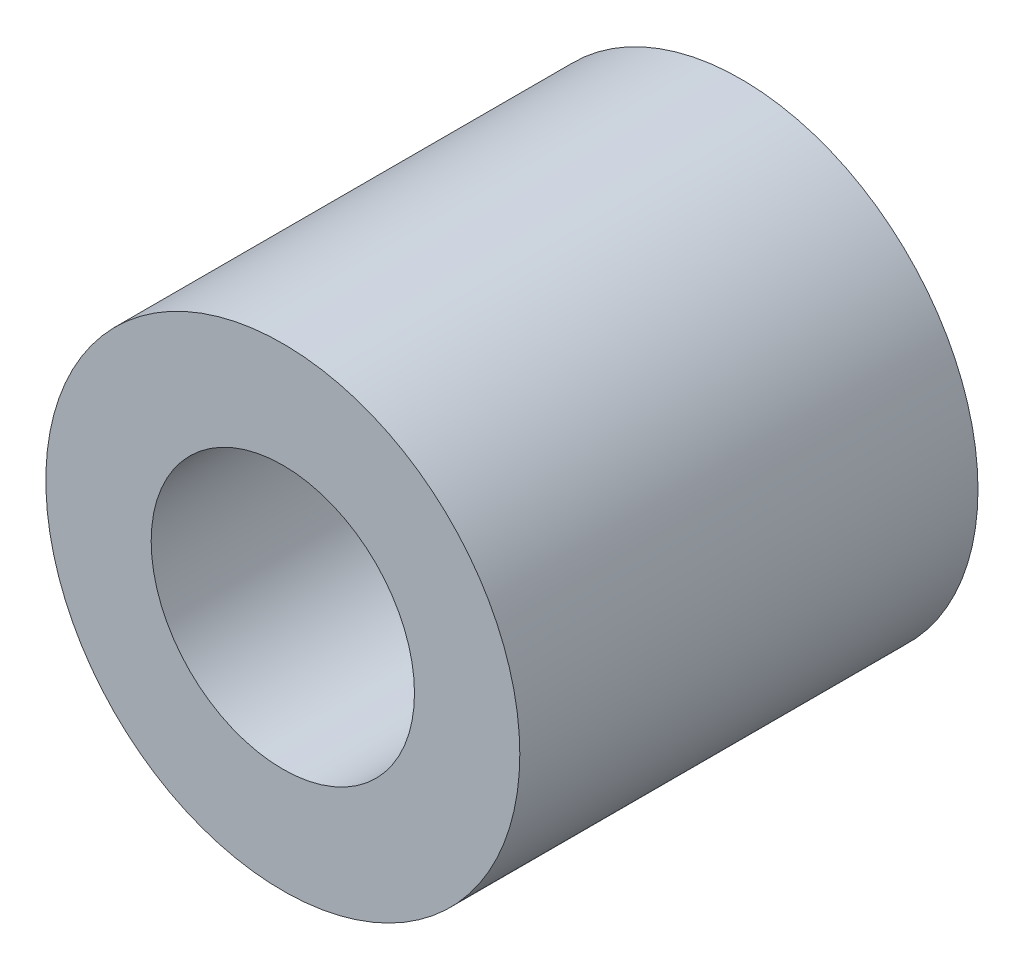
ISO-10303-21;
HEADER;
FILE_DESCRIPTION(('STEP AP214'),'2;1');
FILE_NAME('part.step','',(''),(''),'','','');
FILE_SCHEMA(('AUTOMOTIVE_DESIGN { 1 0 10303 214 1 1 1 1 }'));
ENDSEC;
DATA;
#1=APPLICATION_CONTEXT('core data for automotive mechanical design processes');
#2=APPLICATION_PROTOCOL_DEFINITION('international standard','automotive_design',2000,#1);
#3=PRODUCT_CONTEXT('',#1,'mechanical');
#4=PRODUCT('Part','Part','',(#3));
#5=PRODUCT_RELATED_PRODUCT_CATEGORY('part','',(#4));
#6=PRODUCT_DEFINITION_FORMATION('','',#4);
#7=PRODUCT_DEFINITION_CONTEXT('part definition',#1,'design');
#8=PRODUCT_DEFINITION('design','',#6,#7);
#9=PRODUCT_DEFINITION_SHAPE('','',#8);
#10=(LENGTH_UNIT() NAMED_UNIT(*) SI_UNIT(.MILLI.,.METRE.));
#11=(NAMED_UNIT(*) PLANE_ANGLE_UNIT() SI_UNIT($,.RADIAN.));
#12=(NAMED_UNIT(*) SI_UNIT($,.STERADIAN.) SOLID_ANGLE_UNIT());
#13=UNCERTAINTY_MEASURE_WITH_UNIT(LENGTH_MEASURE(1.E-05),#10,'distance_accuracy_value','');
#14=(GEOMETRIC_REPRESENTATION_CONTEXT(3) GLOBAL_UNCERTAINTY_ASSIGNED_CONTEXT((#13)) GLOBAL_UNIT_ASSIGNED_CONTEXT((#10,
#11,#12)) REPRESENTATION_CONTEXT('',''));
#15=CARTESIAN_POINT('',(0.,0.,0.));
#16=DIRECTION('',(0.,0.,1.));
#17=DIRECTION('',(1.,0.,0.));
#18=AXIS2_PLACEMENT_3D('',#15,#16,#17);
#19=CARTESIAN_POINT('',(0.,0.,20.));
#20=DIRECTION('',(0.,0.,-1.));
#21=DIRECTION('',(-1.,0.,0.));
#22=AXIS2_PLACEMENT_3D('',#19,#20,#21);
#23=CYLINDRICAL_SURFACE('',#22,4.5);
#24=CARTESIAN_POINT('',(0.,0.,0.));
#25=DIRECTION('',(0.,0.,1.));
#26=DIRECTION('',(1.,0.,0.));
#27=AXIS2_PLACEMENT_3D('',#24,#25,#26);
#28=CIRCLE('',#27,4.5);
#29=CARTESIAN_POINT('',(4.5,0.,0.));
#30=VERTEX_POINT('',#29);
#31=EDGE_CURVE('E10',#30,#30,#28,.T.);
#32=ORIENTED_EDGE('',*,*,#31,.T.);
#33=EDGE_LOOP('',(#32));
#34=FACE_BOUND('',#33,.T.);
#35=CARTESIAN_POINT('',(0.,0.,8.7));
#36=DIRECTION('',(0.,0.,1.));
#37=DIRECTION('',(1.,0.,0.));
#38=AXIS2_PLACEMENT_3D('',#35,#36,#37);
#39=CIRCLE('',#38,4.5);
#40=CARTESIAN_POINT('',(4.5,0.,8.7));
#41=VERTEX_POINT('',#40);
#42=EDGE_CURVE('E44',#41,#41,#39,.T.);
#43=ORIENTED_EDGE('',*,*,#42,.F.);
#44=EDGE_LOOP('',(#43));
#45=FACE_BOUND('',#44,.T.);
#46=ADVANCED_FACE('F31',(#34,#45),#23,.T.);
#47=CARTESIAN_POINT('',(0.,0.,20.));
#48=DIRECTION('',(0.,0.,-1.));
#49=DIRECTION('',(-1.,0.,0.));
#50=AXIS2_PLACEMENT_3D('',#47,#48,#49);
#51=CYLINDRICAL_SURFACE('',#50,2.5);
#52=CARTESIAN_POINT('',(0.,0.,0.));
#53=DIRECTION('',(0.,0.,1.));
#54=DIRECTION('',(1.,0.,0.));
#55=AXIS2_PLACEMENT_3D('',#52,#53,#54);
#56=CIRCLE('',#55,2.5);
#57=CARTESIAN_POINT('',(2.5,0.,0.));
#58=VERTEX_POINT('',#57);
#59=EDGE_CURVE('E38',#58,#58,#56,.T.);
#60=ORIENTED_EDGE('',*,*,#59,.F.);
#61=EDGE_LOOP('',(#60));
#62=FACE_BOUND('',#61,.T.);
#63=CARTESIAN_POINT('',(0.,0.,8.7));
#64=DIRECTION('',(0.,0.,1.));
#65=DIRECTION('',(1.,0.,0.));
#66=AXIS2_PLACEMENT_3D('',#63,#64,#65);
#67=CIRCLE('',#66,2.5);
#68=CARTESIAN_POINT('',(2.5,0.,8.7));
#69=VERTEX_POINT('',#68);
#70=EDGE_CURVE('E34',#69,#69,#67,.T.);
#71=ORIENTED_EDGE('',*,*,#70,.T.);
#72=EDGE_LOOP('',(#71));
#73=FACE_BOUND('',#72,.T.);
#74=ADVANCED_FACE('F51',(#62,#73),#51,.F.);
#75=CARTESIAN_POINT('',(0.,0.,0.));
#76=DIRECTION('',(0.,0.,1.));
#77=DIRECTION('',(1.,0.,0.));
#78=AXIS2_PLACEMENT_3D('',#75,#76,#77);
#79=PLANE('',#78);
#80=ORIENTED_EDGE('',*,*,#31,.F.);
#81=EDGE_LOOP('',(#80));
#82=FACE_BOUND('',#81,.T.);
#83=ORIENTED_EDGE('',*,*,#59,.T.);
#84=EDGE_LOOP('',(#83));
#85=FACE_BOUND('',#84,.T.);
#86=ADVANCED_FACE('F55',(#82,#85),#79,.F.);
#87=CARTESIAN_POINT('',(0.,0.,8.7));
#88=DIRECTION('',(0.,0.,1.));
#89=DIRECTION('',(1.,0.,0.));
#90=AXIS2_PLACEMENT_3D('',#87,#88,#89);
#91=PLANE('',#90);
#92=ORIENTED_EDGE('',*,*,#70,.F.);
#93=EDGE_LOOP('',(#92));
#94=FACE_BOUND('',#93,.T.);
#95=ORIENTED_EDGE('',*,*,#42,.T.);
#96=EDGE_LOOP('',(#95));
#97=FACE_BOUND('',#96,.T.);
#98=ADVANCED_FACE('F53',(#94,#97),#91,.T.);
#99=CLOSED_SHELL('',(#46,#74,#86,#98));
#100=MANIFOLD_SOLID_BREP('B2',#99);
#101=ADVANCED_BREP_SHAPE_REPRESENTATION('',(#18,#100),#14);
#102=SHAPE_DEFINITION_REPRESENTATION(#9,#101);
ENDSEC;
END-ISO-10303-21;
